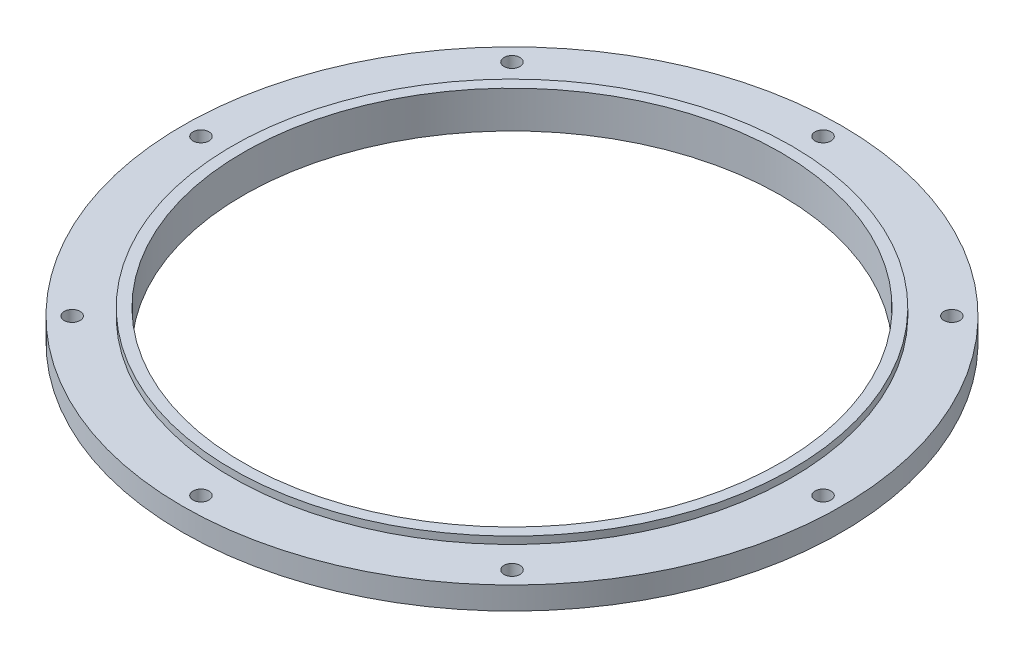
ISO-10303-21;
HEADER;
FILE_DESCRIPTION(('STEP AP214'),'2;1');
FILE_NAME('part.step','',(''),(''),'','','');
FILE_SCHEMA(('AUTOMOTIVE_DESIGN { 1 0 10303 214 1 1 1 1 }'));
ENDSEC;
DATA;
#1=APPLICATION_CONTEXT('core data for automotive mechanical design processes');
#2=APPLICATION_PROTOCOL_DEFINITION('international standard','automotive_design',2000,#1);
#3=PRODUCT_CONTEXT('',#1,'mechanical');
#4=PRODUCT('Part','Part','',(#3));
#5=PRODUCT_RELATED_PRODUCT_CATEGORY('part','',(#4));
#6=PRODUCT_DEFINITION_FORMATION('','',#4);
#7=PRODUCT_DEFINITION_CONTEXT('part definition',#1,'design');
#8=PRODUCT_DEFINITION('design','',#6,#7);
#9=PRODUCT_DEFINITION_SHAPE('','',#8);
#10=(LENGTH_UNIT() NAMED_UNIT(*) SI_UNIT(.MILLI.,.METRE.));
#11=(NAMED_UNIT(*) PLANE_ANGLE_UNIT() SI_UNIT($,.RADIAN.));
#12=(NAMED_UNIT(*) SI_UNIT($,.STERADIAN.) SOLID_ANGLE_UNIT());
#13=UNCERTAINTY_MEASURE_WITH_UNIT(LENGTH_MEASURE(1.E-05),#10,'distance_accuracy_value','');
#14=(GEOMETRIC_REPRESENTATION_CONTEXT(3) GLOBAL_UNCERTAINTY_ASSIGNED_CONTEXT((#13)) GLOBAL_UNIT_ASSIGNED_CONTEXT((#10,
#11,#12)) REPRESENTATION_CONTEXT('',''));
#15=CARTESIAN_POINT('',(0.,0.,0.));
#16=DIRECTION('',(0.,0.,1.));
#17=DIRECTION('',(1.,0.,0.));
#18=AXIS2_PLACEMENT_3D('',#15,#16,#17);
#19=CARTESIAN_POINT('',(0.,0.,0.));
#20=DIRECTION('',(0.,-1.,0.));
#21=DIRECTION('',(0.,0.,-1.));
#22=AXIS2_PLACEMENT_3D('',#19,#20,#21);
#23=CYLINDRICAL_SURFACE('',#22,88.9);
#24=CARTESIAN_POINT('',(0.,6.1,0.));
#25=DIRECTION('',(0.,-1.,0.));
#26=DIRECTION('',(0.,0.,-1.));
#27=AXIS2_PLACEMENT_3D('',#24,#25,#26);
#28=CIRCLE('',#27,88.9);
#29=CARTESIAN_POINT('',(0.,6.1,-88.9));
#30=VERTEX_POINT('',#29);
#31=EDGE_CURVE('E67',#30,#30,#28,.T.);
#32=ORIENTED_EDGE('',*,*,#31,.T.);
#33=EDGE_LOOP('',(#32));
#34=FACE_BOUND('',#33,.T.);
#35=CARTESIAN_POINT('',(0.,0.,0.));
#36=DIRECTION('',(0.,-1.,0.));
#37=DIRECTION('',(0.,0.,-1.));
#38=AXIS2_PLACEMENT_3D('',#35,#36,#37);
#39=CIRCLE('',#38,88.9);
#40=CARTESIAN_POINT('',(0.,0.,-88.9));
#41=VERTEX_POINT('',#40);
#42=EDGE_CURVE('E10',#41,#41,#39,.T.);
#43=ORIENTED_EDGE('',*,*,#42,.F.);
#44=EDGE_LOOP('',(#43));
#45=FACE_BOUND('',#44,.T.);
#46=ADVANCED_FACE('F39',(#34,#45),#23,.T.);
#47=CARTESIAN_POINT('',(75.5,0.,0.));
#48=DIRECTION('',(0.,-1.,0.));
#49=DIRECTION('',(0.,0.,-1.));
#50=AXIS2_PLACEMENT_3D('',#47,#48,#49);
#51=PLANE('',#50);
#52=CARTESIAN_POINT('',(-83.9,0.,0.));
#53=DIRECTION('',(0.,-1.,0.));
#54=DIRECTION('',(0.,0.,-1.));
#55=AXIS2_PLACEMENT_3D('',#52,#53,#54);
#56=CIRCLE('',#55,2.15);
#57=CARTESIAN_POINT('',(-83.9,0.,-2.15));
#58=VERTEX_POINT('',#57);
#59=EDGE_CURVE('E70',#58,#58,#56,.T.);
#60=ORIENTED_EDGE('',*,*,#59,.F.);
#61=EDGE_LOOP('',(#60));
#62=FACE_BOUND('',#61,.T.);
#63=CARTESIAN_POINT('',(-59.3262589415513,0.,-59.3262589415513));
#64=DIRECTION('',(0.,-1.,0.));
#65=DIRECTION('',(0.,0.,-1.));
#66=AXIS2_PLACEMENT_3D('',#63,#64,#65);
#67=CIRCLE('',#66,2.15);
#68=CARTESIAN_POINT('',(-59.3262589415513,0.,-61.4762589415513));
#69=VERTEX_POINT('',#68);
#70=EDGE_CURVE('E73',#69,#69,#67,.T.);
#71=ORIENTED_EDGE('',*,*,#70,.F.);
#72=EDGE_LOOP('',(#71));
#73=FACE_BOUND('',#72,.T.);
#74=CARTESIAN_POINT('',(0.,0.,-83.9));
#75=DIRECTION('',(0.,-1.,0.));
#76=DIRECTION('',(0.,0.,-1.));
#77=AXIS2_PLACEMENT_3D('',#74,#75,#76);
#78=CIRCLE('',#77,2.15);
#79=CARTESIAN_POINT('',(0.,0.,-86.05));
#80=VERTEX_POINT('',#79);
#81=EDGE_CURVE('E76',#80,#80,#78,.T.);
#82=ORIENTED_EDGE('',*,*,#81,.F.);
#83=EDGE_LOOP('',(#82));
#84=FACE_BOUND('',#83,.T.);
#85=CARTESIAN_POINT('',(59.3262589415513,0.,-59.3262589415513));
#86=DIRECTION('',(0.,-1.,0.));
#87=DIRECTION('',(0.,0.,-1.));
#88=AXIS2_PLACEMENT_3D('',#85,#86,#87);
#89=CIRCLE('',#88,2.15);
#90=CARTESIAN_POINT('',(59.3262589415513,0.,-61.4762589415513));
#91=VERTEX_POINT('',#90);
#92=EDGE_CURVE('E79',#91,#91,#89,.T.);
#93=ORIENTED_EDGE('',*,*,#92,.F.);
#94=EDGE_LOOP('',(#93));
#95=FACE_BOUND('',#94,.T.);
#96=CARTESIAN_POINT('',(83.9,0.,0.));
#97=DIRECTION('',(0.,-1.,0.));
#98=DIRECTION('',(0.,0.,-1.));
#99=AXIS2_PLACEMENT_3D('',#96,#97,#98);
#100=CIRCLE('',#99,2.15);
#101=CARTESIAN_POINT('',(83.9,0.,-2.15000000000001));
#102=VERTEX_POINT('',#101);
#103=EDGE_CURVE('E82',#102,#102,#100,.T.);
#104=ORIENTED_EDGE('',*,*,#103,.F.);
#105=EDGE_LOOP('',(#104));
#106=FACE_BOUND('',#105,.T.);
#107=CARTESIAN_POINT('',(59.3262589415514,0.,59.3262589415513));
#108=DIRECTION('',(0.,-1.,0.));
#109=DIRECTION('',(0.,0.,-1.));
#110=AXIS2_PLACEMENT_3D('',#107,#108,#109);
#111=CIRCLE('',#110,2.15);
#112=CARTESIAN_POINT('',(59.3262589415514,0.,57.1762589415513));
#113=VERTEX_POINT('',#112);
#114=EDGE_CURVE('E85',#113,#113,#111,.T.);
#115=ORIENTED_EDGE('',*,*,#114,.F.);
#116=EDGE_LOOP('',(#115));
#117=FACE_BOUND('',#116,.T.);
#118=CARTESIAN_POINT('',(0.,0.,83.9));
#119=DIRECTION('',(0.,-1.,0.));
#120=DIRECTION('',(0.,0.,-1.));
#121=AXIS2_PLACEMENT_3D('',#118,#119,#120);
#122=CIRCLE('',#121,2.15);
#123=CARTESIAN_POINT('',(0.,0.,81.75));
#124=VERTEX_POINT('',#123);
#125=EDGE_CURVE('E88',#124,#124,#122,.T.);
#126=ORIENTED_EDGE('',*,*,#125,.F.);
#127=EDGE_LOOP('',(#126));
#128=FACE_BOUND('',#127,.T.);
#129=CARTESIAN_POINT('',(-59.3262589415513,0.,59.3262589415513));
#130=DIRECTION('',(0.,-1.,0.));
#131=DIRECTION('',(0.,0.,-1.));
#132=AXIS2_PLACEMENT_3D('',#129,#130,#131);
#133=CIRCLE('',#132,2.15);
#134=CARTESIAN_POINT('',(-59.3262589415513,0.,57.1762589415513));
#135=VERTEX_POINT('',#134);
#136=EDGE_CURVE('E91',#135,#135,#133,.T.);
#137=ORIENTED_EDGE('',*,*,#136,.F.);
#138=EDGE_LOOP('',(#137));
#139=FACE_BOUND('',#138,.T.);
#140=ORIENTED_EDGE('',*,*,#42,.T.);
#141=EDGE_LOOP('',(#140));
#142=FACE_BOUND('',#141,.T.);
#143=CARTESIAN_POINT('',(0.,0.,0.));
#144=DIRECTION('',(0.,-1.,0.));
#145=DIRECTION('',(0.,0.,-1.));
#146=AXIS2_PLACEMENT_3D('',#143,#144,#145);
#147=CIRCLE('',#146,75.5);
#148=CARTESIAN_POINT('',(0.,0.,-75.5));
#149=VERTEX_POINT('',#148);
#150=EDGE_CURVE('E45',#149,#149,#147,.T.);
#151=ORIENTED_EDGE('',*,*,#150,.F.);
#152=EDGE_LOOP('',(#151));
#153=FACE_BOUND('',#152,.T.);
#154=ADVANCED_FACE('F147',(#62,#73,#84,#95,#106,#117,#128,#139,#142,#153),#51,.T.);
#155=CARTESIAN_POINT('',(0.,0.,0.));
#156=DIRECTION('',(0.,-1.,0.));
#157=DIRECTION('',(0.,0.,-1.));
#158=AXIS2_PLACEMENT_3D('',#155,#156,#157);
#159=CYLINDRICAL_SURFACE('',#158,75.5);
#160=ORIENTED_EDGE('',*,*,#150,.T.);
#161=EDGE_LOOP('',(#160));
#162=FACE_BOUND('',#161,.T.);
#163=CARTESIAN_POINT('',(0.,-1.95,0.));
#164=DIRECTION('',(0.,-1.,0.));
#165=DIRECTION('',(0.,0.,-1.));
#166=AXIS2_PLACEMENT_3D('',#163,#164,#165);
#167=CIRCLE('',#166,75.5);
#168=CARTESIAN_POINT('',(0.,-1.95,-75.5));
#169=VERTEX_POINT('',#168);
#170=EDGE_CURVE('E49',#169,#169,#167,.T.);
#171=ORIENTED_EDGE('',*,*,#170,.F.);
#172=EDGE_LOOP('',(#171));
#173=FACE_BOUND('',#172,.T.);
#174=ADVANCED_FACE('F152',(#162,#173),#159,.T.);
#175=CARTESIAN_POINT('',(72.5,-1.95,0.));
#176=DIRECTION('',(0.,-1.,0.));
#177=DIRECTION('',(0.,0.,-1.));
#178=AXIS2_PLACEMENT_3D('',#175,#176,#177);
#179=PLANE('',#178);
#180=ORIENTED_EDGE('',*,*,#170,.T.);
#181=EDGE_LOOP('',(#180));
#182=FACE_BOUND('',#181,.T.);
#183=CARTESIAN_POINT('',(0.,-1.95,0.));
#184=DIRECTION('',(0.,-1.,0.));
#185=DIRECTION('',(0.,0.,-1.));
#186=AXIS2_PLACEMENT_3D('',#183,#184,#185);
#187=CIRCLE('',#186,72.5);
#188=CARTESIAN_POINT('',(0.,-1.95,-72.5));
#189=VERTEX_POINT('',#188);
#190=EDGE_CURVE('E53',#189,#189,#187,.T.);
#191=ORIENTED_EDGE('',*,*,#190,.F.);
#192=EDGE_LOOP('',(#191));
#193=FACE_BOUND('',#192,.T.);
#194=ADVANCED_FACE('F157',(#182,#193),#179,.T.);
#195=CARTESIAN_POINT('',(0.,0.,0.));
#196=DIRECTION('',(0.,-1.,0.));
#197=DIRECTION('',(0.,0.,-1.));
#198=AXIS2_PLACEMENT_3D('',#195,#196,#197);
#199=CYLINDRICAL_SURFACE('',#198,72.5);
#200=ORIENTED_EDGE('',*,*,#190,.T.);
#201=EDGE_LOOP('',(#200));
#202=FACE_BOUND('',#201,.T.);
#203=CARTESIAN_POINT('',(0.,8.05,0.));
#204=DIRECTION('',(0.,-1.,0.));
#205=DIRECTION('',(0.,0.,-1.));
#206=AXIS2_PLACEMENT_3D('',#203,#204,#205);
#207=CIRCLE('',#206,72.5);
#208=CARTESIAN_POINT('',(0.,8.05,-72.5));
#209=VERTEX_POINT('',#208);
#210=EDGE_CURVE('E58',#209,#209,#207,.T.);
#211=ORIENTED_EDGE('',*,*,#210,.F.);
#212=EDGE_LOOP('',(#211));
#213=FACE_BOUND('',#212,.T.);
#214=ADVANCED_FACE('F164',(#202,#213),#199,.F.);
#215=CARTESIAN_POINT('',(72.5,8.05,0.));
#216=DIRECTION('',(0.,1.,0.));
#217=DIRECTION('',(0.,0.,1.));
#218=AXIS2_PLACEMENT_3D('',#215,#216,#217);
#219=PLANE('',#218);
#220=ORIENTED_EDGE('',*,*,#210,.T.);
#221=EDGE_LOOP('',(#220));
#222=FACE_BOUND('',#221,.T.);
#223=CARTESIAN_POINT('',(0.,8.05,0.));
#224=DIRECTION('',(0.,-1.,0.));
#225=DIRECTION('',(0.,0.,-1.));
#226=AXIS2_PLACEMENT_3D('',#223,#224,#225);
#227=CIRCLE('',#226,75.5);
#228=CARTESIAN_POINT('',(0.,8.05,-75.5));
#229=VERTEX_POINT('',#228);
#230=EDGE_CURVE('E61',#229,#229,#227,.T.);
#231=ORIENTED_EDGE('',*,*,#230,.F.);
#232=EDGE_LOOP('',(#231));
#233=FACE_BOUND('',#232,.T.);
#234=ADVANCED_FACE('F168',(#222,#233),#219,.T.);
#235=CARTESIAN_POINT('',(0.,0.,0.));
#236=DIRECTION('',(0.,-1.,0.));
#237=DIRECTION('',(0.,0.,-1.));
#238=AXIS2_PLACEMENT_3D('',#235,#236,#237);
#239=CYLINDRICAL_SURFACE('',#238,75.5);
#240=ORIENTED_EDGE('',*,*,#230,.T.);
#241=EDGE_LOOP('',(#240));
#242=FACE_BOUND('',#241,.T.);
#243=CARTESIAN_POINT('',(0.,6.1,0.));
#244=DIRECTION('',(0.,-1.,0.));
#245=DIRECTION('',(0.,0.,-1.));
#246=AXIS2_PLACEMENT_3D('',#243,#244,#245);
#247=CIRCLE('',#246,75.5);
#248=CARTESIAN_POINT('',(0.,6.1,-75.5));
#249=VERTEX_POINT('',#248);
#250=EDGE_CURVE('E64',#249,#249,#247,.T.);
#251=ORIENTED_EDGE('',*,*,#250,.F.);
#252=EDGE_LOOP('',(#251));
#253=FACE_BOUND('',#252,.T.);
#254=ADVANCED_FACE('F125',(#242,#253),#239,.T.);
#255=CARTESIAN_POINT('',(75.5,6.1,0.));
#256=DIRECTION('',(0.,1.,0.));
#257=DIRECTION('',(0.,0.,1.));
#258=AXIS2_PLACEMENT_3D('',#255,#256,#257);
#259=PLANE('',#258);
#260=CARTESIAN_POINT('',(-83.9,6.1,0.));
#261=DIRECTION('',(0.,1.,0.));
#262=DIRECTION('',(0.,0.,1.));
#263=AXIS2_PLACEMENT_3D('',#260,#261,#262);
#264=CIRCLE('',#263,2.15);
#265=CARTESIAN_POINT('',(-83.9,6.1,2.15));
#266=VERTEX_POINT('',#265);
#267=EDGE_CURVE('E94',#266,#266,#264,.T.);
#268=ORIENTED_EDGE('',*,*,#267,.F.);
#269=EDGE_LOOP('',(#268));
#270=FACE_BOUND('',#269,.T.);
#271=CARTESIAN_POINT('',(-59.3262589415513,6.1,-59.3262589415513));
#272=DIRECTION('',(0.,1.,0.));
#273=DIRECTION('',(0.,0.,1.));
#274=AXIS2_PLACEMENT_3D('',#271,#272,#273);
#275=CIRCLE('',#274,2.15);
#276=CARTESIAN_POINT('',(-59.3262589415513,6.1,-57.1762589415513));
#277=VERTEX_POINT('',#276);
#278=EDGE_CURVE('E113',#277,#277,#275,.T.);
#279=ORIENTED_EDGE('',*,*,#278,.F.);
#280=EDGE_LOOP('',(#279));
#281=FACE_BOUND('',#280,.T.);
#282=CARTESIAN_POINT('',(0.,6.1,-83.9));
#283=DIRECTION('',(0.,1.,0.));
#284=DIRECTION('',(0.,0.,1.));
#285=AXIS2_PLACEMENT_3D('',#282,#283,#284);
#286=CIRCLE('',#285,2.15);
#287=CARTESIAN_POINT('',(0.,6.1,-81.75));
#288=VERTEX_POINT('',#287);
#289=EDGE_CURVE('E110',#288,#288,#286,.T.);
#290=ORIENTED_EDGE('',*,*,#289,.F.);
#291=EDGE_LOOP('',(#290));
#292=FACE_BOUND('',#291,.T.);
#293=CARTESIAN_POINT('',(59.3262589415513,6.1,-59.3262589415513));
#294=DIRECTION('',(0.,1.,0.));
#295=DIRECTION('',(0.,0.,1.));
#296=AXIS2_PLACEMENT_3D('',#293,#294,#295);
#297=CIRCLE('',#296,2.15);
#298=CARTESIAN_POINT('',(59.3262589415513,6.1,-57.1762589415513));
#299=VERTEX_POINT('',#298);
#300=EDGE_CURVE('E107',#299,#299,#297,.T.);
#301=ORIENTED_EDGE('',*,*,#300,.F.);
#302=EDGE_LOOP('',(#301));
#303=FACE_BOUND('',#302,.T.);
#304=CARTESIAN_POINT('',(83.9,6.1,0.));
#305=DIRECTION('',(0.,1.,0.));
#306=DIRECTION('',(0.,0.,1.));
#307=AXIS2_PLACEMENT_3D('',#304,#305,#306);
#308=CIRCLE('',#307,2.15);
#309=CARTESIAN_POINT('',(83.9,6.1,2.14999999999999));
#310=VERTEX_POINT('',#309);
#311=EDGE_CURVE('E104',#310,#310,#308,.T.);
#312=ORIENTED_EDGE('',*,*,#311,.F.);
#313=EDGE_LOOP('',(#312));
#314=FACE_BOUND('',#313,.T.);
#315=CARTESIAN_POINT('',(59.3262589415514,6.1,59.3262589415513));
#316=DIRECTION('',(0.,1.,0.));
#317=DIRECTION('',(0.,0.,1.));
#318=AXIS2_PLACEMENT_3D('',#315,#316,#317);
#319=CIRCLE('',#318,2.15);
#320=CARTESIAN_POINT('',(59.3262589415514,6.1,61.4762589415513));
#321=VERTEX_POINT('',#320);
#322=EDGE_CURVE('E101',#321,#321,#319,.T.);
#323=ORIENTED_EDGE('',*,*,#322,.F.);
#324=EDGE_LOOP('',(#323));
#325=FACE_BOUND('',#324,.T.);
#326=CARTESIAN_POINT('',(0.,6.1,83.9));
#327=DIRECTION('',(0.,1.,0.));
#328=DIRECTION('',(0.,0.,1.));
#329=AXIS2_PLACEMENT_3D('',#326,#327,#328);
#330=CIRCLE('',#329,2.15);
#331=CARTESIAN_POINT('',(0.,6.1,86.05));
#332=VERTEX_POINT('',#331);
#333=EDGE_CURVE('E98',#332,#332,#330,.T.);
#334=ORIENTED_EDGE('',*,*,#333,.F.);
#335=EDGE_LOOP('',(#334));
#336=FACE_BOUND('',#335,.T.);
#337=CARTESIAN_POINT('',(-59.3262589415513,6.1,59.3262589415513));
#338=DIRECTION('',(0.,1.,0.));
#339=DIRECTION('',(0.,0.,1.));
#340=AXIS2_PLACEMENT_3D('',#337,#338,#339);
#341=CIRCLE('',#340,2.15);
#342=CARTESIAN_POINT('',(-59.3262589415513,6.1,61.4762589415513));
#343=VERTEX_POINT('',#342);
#344=EDGE_CURVE('E95',#343,#343,#341,.T.);
#345=ORIENTED_EDGE('',*,*,#344,.F.);
#346=EDGE_LOOP('',(#345));
#347=FACE_BOUND('',#346,.T.);
#348=ORIENTED_EDGE('',*,*,#250,.T.);
#349=EDGE_LOOP('',(#348));
#350=FACE_BOUND('',#349,.T.);
#351=ORIENTED_EDGE('',*,*,#31,.F.);
#352=EDGE_LOOP('',(#351));
#353=FACE_BOUND('',#352,.T.);
#354=ADVANCED_FACE('F121',(#270,#281,#292,#303,#314,#325,#336,#347,#350,#353),#259,.T.);
#355=CARTESIAN_POINT('',(-59.3262589415513,-3.9,59.3262589415513));
#356=DIRECTION('',(0.,1.,0.));
#357=DIRECTION('',(0.,0.,1.));
#358=AXIS2_PLACEMENT_3D('',#355,#356,#357);
#359=CYLINDRICAL_SURFACE('',#358,2.15);
#360=ORIENTED_EDGE('',*,*,#136,.T.);
#361=EDGE_LOOP('',(#360));
#362=FACE_BOUND('',#361,.T.);
#363=ORIENTED_EDGE('',*,*,#344,.T.);
#364=EDGE_LOOP('',(#363));
#365=FACE_BOUND('',#364,.T.);
#366=ADVANCED_FACE('F124',(#362,#365),#359,.F.);
#367=CARTESIAN_POINT('',(0.,-3.9,83.9));
#368=DIRECTION('',(0.,1.,0.));
#369=DIRECTION('',(0.,0.,1.));
#370=AXIS2_PLACEMENT_3D('',#367,#368,#369);
#371=CYLINDRICAL_SURFACE('',#370,2.15);
#372=ORIENTED_EDGE('',*,*,#125,.T.);
#373=EDGE_LOOP('',(#372));
#374=FACE_BOUND('',#373,.T.);
#375=ORIENTED_EDGE('',*,*,#333,.T.);
#376=EDGE_LOOP('',(#375));
#377=FACE_BOUND('',#376,.T.);
#378=ADVANCED_FACE('F177',(#374,#377),#371,.F.);
#379=CARTESIAN_POINT('',(59.3262589415514,-3.9,59.3262589415513));
#380=DIRECTION('',(0.,1.,0.));
#381=DIRECTION('',(0.,0.,1.));
#382=AXIS2_PLACEMENT_3D('',#379,#380,#381);
#383=CYLINDRICAL_SURFACE('',#382,2.15);
#384=ORIENTED_EDGE('',*,*,#114,.T.);
#385=EDGE_LOOP('',(#384));
#386=FACE_BOUND('',#385,.T.);
#387=ORIENTED_EDGE('',*,*,#322,.T.);
#388=EDGE_LOOP('',(#387));
#389=FACE_BOUND('',#388,.T.);
#390=ADVANCED_FACE('F181',(#386,#389),#383,.F.);
#391=CARTESIAN_POINT('',(83.9,-3.9,0.));
#392=DIRECTION('',(0.,1.,0.));
#393=DIRECTION('',(0.,0.,1.));
#394=AXIS2_PLACEMENT_3D('',#391,#392,#393);
#395=CYLINDRICAL_SURFACE('',#394,2.15);
#396=ORIENTED_EDGE('',*,*,#103,.T.);
#397=EDGE_LOOP('',(#396));
#398=FACE_BOUND('',#397,.T.);
#399=ORIENTED_EDGE('',*,*,#311,.T.);
#400=EDGE_LOOP('',(#399));
#401=FACE_BOUND('',#400,.T.);
#402=ADVANCED_FACE('F185',(#398,#401),#395,.F.);
#403=CARTESIAN_POINT('',(59.3262589415513,-3.9,-59.3262589415513));
#404=DIRECTION('',(0.,1.,0.));
#405=DIRECTION('',(0.,0.,1.));
#406=AXIS2_PLACEMENT_3D('',#403,#404,#405);
#407=CYLINDRICAL_SURFACE('',#406,2.15);
#408=ORIENTED_EDGE('',*,*,#92,.T.);
#409=EDGE_LOOP('',(#408));
#410=FACE_BOUND('',#409,.T.);
#411=ORIENTED_EDGE('',*,*,#300,.T.);
#412=EDGE_LOOP('',(#411));
#413=FACE_BOUND('',#412,.T.);
#414=ADVANCED_FACE('F189',(#410,#413),#407,.F.);
#415=CARTESIAN_POINT('',(0.,-3.9,-83.9));
#416=DIRECTION('',(0.,1.,0.));
#417=DIRECTION('',(0.,0.,1.));
#418=AXIS2_PLACEMENT_3D('',#415,#416,#417);
#419=CYLINDRICAL_SURFACE('',#418,2.15);
#420=ORIENTED_EDGE('',*,*,#81,.T.);
#421=EDGE_LOOP('',(#420));
#422=FACE_BOUND('',#421,.T.);
#423=ORIENTED_EDGE('',*,*,#289,.T.);
#424=EDGE_LOOP('',(#423));
#425=FACE_BOUND('',#424,.T.);
#426=ADVANCED_FACE('F193',(#422,#425),#419,.F.);
#427=CARTESIAN_POINT('',(-59.3262589415513,-3.9,-59.3262589415513));
#428=DIRECTION('',(0.,1.,0.));
#429=DIRECTION('',(0.,0.,1.));
#430=AXIS2_PLACEMENT_3D('',#427,#428,#429);
#431=CYLINDRICAL_SURFACE('',#430,2.15);
#432=ORIENTED_EDGE('',*,*,#70,.T.);
#433=EDGE_LOOP('',(#432));
#434=FACE_BOUND('',#433,.T.);
#435=ORIENTED_EDGE('',*,*,#278,.T.);
#436=EDGE_LOOP('',(#435));
#437=FACE_BOUND('',#436,.T.);
#438=ADVANCED_FACE('F197',(#434,#437),#431,.F.);
#439=CARTESIAN_POINT('',(-83.9,-3.9,0.));
#440=DIRECTION('',(0.,1.,0.));
#441=DIRECTION('',(0.,0.,1.));
#442=AXIS2_PLACEMENT_3D('',#439,#440,#441);
#443=CYLINDRICAL_SURFACE('',#442,2.15);
#444=ORIENTED_EDGE('',*,*,#59,.T.);
#445=EDGE_LOOP('',(#444));
#446=FACE_BOUND('',#445,.T.);
#447=ORIENTED_EDGE('',*,*,#267,.T.);
#448=EDGE_LOOP('',(#447));
#449=FACE_BOUND('',#448,.T.);
#450=ADVANCED_FACE('F119',(#446,#449),#443,.F.);
#451=CLOSED_SHELL('',(#46,#154,#174,#194,#214,#234,#254,#354,#366,#378,#390,#402,#414,#426,#438,#450));
#452=MANIFOLD_SOLID_BREP('B2',#451);
#453=ADVANCED_BREP_SHAPE_REPRESENTATION('',(#18,#452),#14);
#454=SHAPE_DEFINITION_REPRESENTATION(#9,#453);
ENDSEC;
END-ISO-10303-21;
